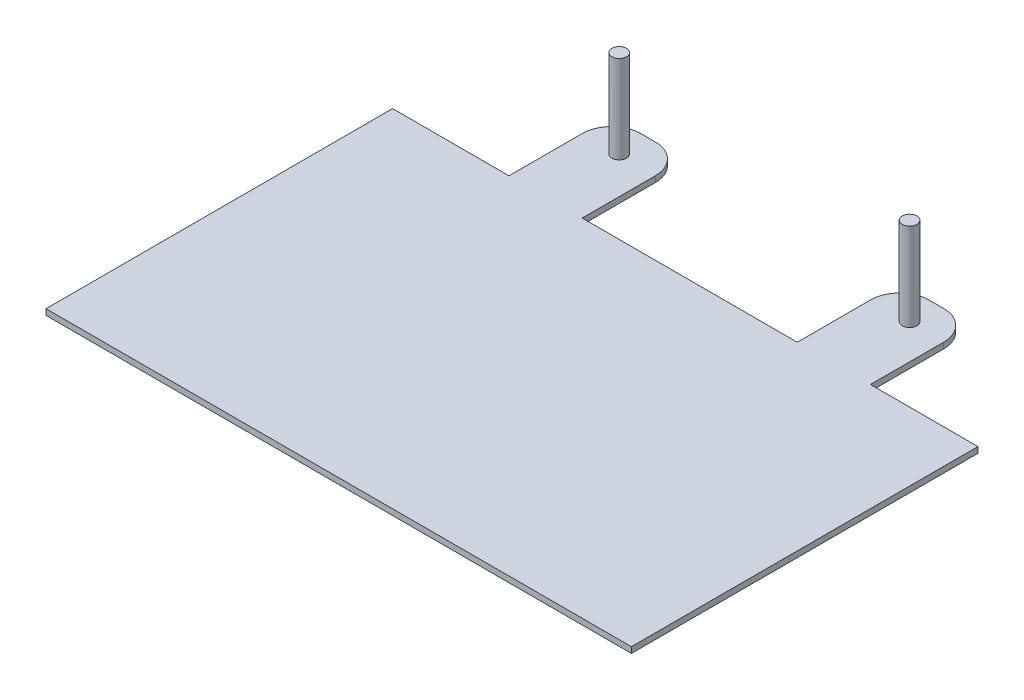
ISO-10303-21;
HEADER;
FILE_DESCRIPTION(('STEP AP214'),'2;1');
FILE_NAME('part.step','',(''),(''),'','','');
FILE_SCHEMA(('AUTOMOTIVE_DESIGN { 1 0 10303 214 1 1 1 1 }'));
ENDSEC;
DATA;
#1=APPLICATION_CONTEXT('core data for automotive mechanical design processes');
#2=APPLICATION_PROTOCOL_DEFINITION('international standard','automotive_design',2000,#1);
#3=PRODUCT_CONTEXT('',#1,'mechanical');
#4=PRODUCT('Part','Part','',(#3));
#5=PRODUCT_RELATED_PRODUCT_CATEGORY('part','',(#4));
#6=PRODUCT_DEFINITION_FORMATION('','',#4);
#7=PRODUCT_DEFINITION_CONTEXT('part definition',#1,'design');
#8=PRODUCT_DEFINITION('design','',#6,#7);
#9=PRODUCT_DEFINITION_SHAPE('','',#8);
#10=(LENGTH_UNIT() NAMED_UNIT(*) SI_UNIT(.MILLI.,.METRE.));
#11=(NAMED_UNIT(*) PLANE_ANGLE_UNIT() SI_UNIT($,.RADIAN.));
#12=(NAMED_UNIT(*) SI_UNIT($,.STERADIAN.) SOLID_ANGLE_UNIT());
#13=UNCERTAINTY_MEASURE_WITH_UNIT(LENGTH_MEASURE(1.E-05),#10,'distance_accuracy_value','');
#14=(GEOMETRIC_REPRESENTATION_CONTEXT(3) GLOBAL_UNCERTAINTY_ASSIGNED_CONTEXT((#13)) GLOBAL_UNIT_ASSIGNED_CONTEXT((#10,
#11,#12)) REPRESENTATION_CONTEXT('',''));
#15=CARTESIAN_POINT('',(0.,0.,0.));
#16=DIRECTION('',(0.,0.,1.));
#17=DIRECTION('',(1.,0.,0.));
#18=AXIS2_PLACEMENT_3D('',#15,#16,#17);
#19=CARTESIAN_POINT('',(0.,2.,0.));
#20=DIRECTION('',(1.,0.,0.));
#21=DIRECTION('',(0.,0.,-1.));
#22=AXIS2_PLACEMENT_3D('',#19,#20,#21);
#23=PLANE('',#22);
#24=DIRECTION('',(0.,0.,1.));
#25=VECTOR('',#24,1.);
#26=CARTESIAN_POINT('',(0.,0.,0.));
#27=LINE('',#26,#25);
#28=CARTESIAN_POINT('',(0.,0.,-118.409090909091));
#29=VERTEX_POINT('',#28);
#30=CARTESIAN_POINT('',(0.,0.,0.));
#31=VERTEX_POINT('',#30);
#32=EDGE_CURVE('E180',#29,#31,#27,.T.);
#33=ORIENTED_EDGE('',*,*,#32,.T.);
#34=DIRECTION('',(0.,-1.,0.));
#35=VECTOR('',#34,1.);
#36=CARTESIAN_POINT('',(0.,2.,0.));
#37=LINE('',#36,#35);
#38=CARTESIAN_POINT('',(0.,2.,0.));
#39=VERTEX_POINT('',#38);
#40=EDGE_CURVE('E248',#39,#31,#37,.T.);
#41=ORIENTED_EDGE('',*,*,#40,.F.);
#42=DIRECTION('',(0.,0.,1.));
#43=VECTOR('',#42,1.);
#44=CARTESIAN_POINT('',(0.,2.,0.));
#45=LINE('',#44,#43);
#46=CARTESIAN_POINT('',(0.,2.,-118.409090909091));
#47=VERTEX_POINT('',#46);
#48=EDGE_CURVE('E211',#47,#39,#45,.T.);
#49=ORIENTED_EDGE('',*,*,#48,.F.);
#50=DIRECTION('',(0.,-1.,0.));
#51=VECTOR('',#50,1.);
#52=CARTESIAN_POINT('',(0.,2.,-118.409090909091));
#53=LINE('',#52,#51);
#54=EDGE_CURVE('E176',#47,#29,#53,.T.);
#55=ORIENTED_EDGE('',*,*,#54,.T.);
#56=EDGE_LOOP('',(#33,#41,#49,#55));
#57=FACE_BOUND('',#56,.T.);
#58=ADVANCED_FACE('F35',(#57),#23,.F.);
#59=CARTESIAN_POINT('',(0.,2.,0.));
#60=DIRECTION('',(0.,0.,-1.));
#61=DIRECTION('',(-1.,0.,0.));
#62=AXIS2_PLACEMENT_3D('',#59,#60,#61);
#63=PLANE('',#62);
#64=DIRECTION('',(1.,0.,0.));
#65=VECTOR('',#64,1.);
#66=CARTESIAN_POINT('',(0.,0.,0.));
#67=LINE('',#66,#65);
#68=CARTESIAN_POINT('',(200.,0.,0.));
#69=VERTEX_POINT('',#68);
#70=EDGE_CURVE('E183',#31,#69,#67,.T.);
#71=ORIENTED_EDGE('',*,*,#70,.T.);
#72=DIRECTION('',(0.,-1.,0.));
#73=VECTOR('',#72,1.);
#74=CARTESIAN_POINT('',(200.,2.,0.));
#75=LINE('',#74,#73);
#76=CARTESIAN_POINT('',(200.,2.,0.));
#77=VERTEX_POINT('',#76);
#78=EDGE_CURVE('E245',#77,#69,#75,.T.);
#79=ORIENTED_EDGE('',*,*,#78,.F.);
#80=DIRECTION('',(1.,0.,0.));
#81=VECTOR('',#80,1.);
#82=CARTESIAN_POINT('',(0.,2.,0.));
#83=LINE('',#82,#81);
#84=EDGE_CURVE('E119',#39,#77,#83,.T.);
#85=ORIENTED_EDGE('',*,*,#84,.F.);
#86=ORIENTED_EDGE('',*,*,#40,.T.);
#87=EDGE_LOOP('',(#71,#79,#85,#86));
#88=FACE_BOUND('',#87,.T.);
#89=ADVANCED_FACE('F271',(#88),#63,.F.);
#90=CARTESIAN_POINT('',(200.,2.,0.));
#91=DIRECTION('',(-1.,0.,0.));
#92=DIRECTION('',(0.,0.,1.));
#93=AXIS2_PLACEMENT_3D('',#90,#91,#92);
#94=PLANE('',#93);
#95=DIRECTION('',(0.,0.,-1.));
#96=VECTOR('',#95,1.);
#97=CARTESIAN_POINT('',(200.,0.,0.));
#98=LINE('',#97,#96);
#99=CARTESIAN_POINT('',(200.,0.,-118.409090909091));
#100=VERTEX_POINT('',#99);
#101=EDGE_CURVE('E186',#69,#100,#98,.T.);
#102=ORIENTED_EDGE('',*,*,#101,.T.);
#103=DIRECTION('',(0.,-1.,0.));
#104=VECTOR('',#103,1.);
#105=CARTESIAN_POINT('',(200.,2.,-118.409090909091));
#106=LINE('',#105,#104);
#107=CARTESIAN_POINT('',(200.,2.,-118.409090909091));
#108=VERTEX_POINT('',#107);
#109=EDGE_CURVE('E242',#108,#100,#106,.T.);
#110=ORIENTED_EDGE('',*,*,#109,.F.);
#111=DIRECTION('',(0.,0.,-1.));
#112=VECTOR('',#111,1.);
#113=CARTESIAN_POINT('',(200.,2.,0.));
#114=LINE('',#113,#112);
#115=EDGE_CURVE('E285',#77,#108,#114,.T.);
#116=ORIENTED_EDGE('',*,*,#115,.F.);
#117=ORIENTED_EDGE('',*,*,#78,.T.);
#118=EDGE_LOOP('',(#102,#110,#116,#117));
#119=FACE_BOUND('',#118,.T.);
#120=ADVANCED_FACE('F276',(#119),#94,.F.);
#121=CARTESIAN_POINT('',(163.257575757576,2.,-118.409090909091));
#122=DIRECTION('',(0.,0.,1.));
#123=DIRECTION('',(1.,0.,0.));
#124=AXIS2_PLACEMENT_3D('',#121,#122,#123);
#125=PLANE('',#124);
#126=DIRECTION('',(-1.,0.,0.));
#127=VECTOR('',#126,1.);
#128=CARTESIAN_POINT('',(163.257575757576,0.,-118.409090909091));
#129=LINE('',#128,#127);
#130=CARTESIAN_POINT('',(163.257575757576,0.,-118.409090909091));
#131=VERTEX_POINT('',#130);
#132=EDGE_CURVE('E188',#100,#131,#129,.T.);
#133=ORIENTED_EDGE('',*,*,#132,.T.);
#134=DIRECTION('',(0.,-1.,0.));
#135=VECTOR('',#134,1.);
#136=CARTESIAN_POINT('',(163.257575757576,2.,-118.409090909091));
#137=LINE('',#136,#135);
#138=CARTESIAN_POINT('',(163.257575757576,2.,-118.409090909091));
#139=VERTEX_POINT('',#138);
#140=EDGE_CURVE('E239',#139,#131,#137,.T.);
#141=ORIENTED_EDGE('',*,*,#140,.F.);
#142=DIRECTION('',(-1.,0.,0.));
#143=VECTOR('',#142,1.);
#144=CARTESIAN_POINT('',(163.257575757576,2.,-118.409090909091));
#145=LINE('',#144,#143);
#146=EDGE_CURVE('E287',#108,#139,#145,.T.);
#147=ORIENTED_EDGE('',*,*,#146,.F.);
#148=ORIENTED_EDGE('',*,*,#109,.T.);
#149=EDGE_LOOP('',(#133,#141,#147,#148));
#150=FACE_BOUND('',#149,.T.);
#151=ADVANCED_FACE('F353',(#150),#125,.F.);
#152=CARTESIAN_POINT('',(163.257575757576,2.,-118.409090909091));
#153=DIRECTION('',(-1.,0.,0.));
#154=DIRECTION('',(0.,0.,1.));
#155=AXIS2_PLACEMENT_3D('',#152,#153,#154);
#156=PLANE('',#155);
#157=DIRECTION('',(0.,0.,-1.));
#158=VECTOR('',#157,1.);
#159=CARTESIAN_POINT('',(163.257575757576,0.,-118.409090909091));
#160=LINE('',#159,#158);
#161=CARTESIAN_POINT('',(163.257575757576,0.,-143.409090909091));
#162=VERTEX_POINT('',#161);
#163=EDGE_CURVE('E190',#131,#162,#160,.T.);
#164=ORIENTED_EDGE('',*,*,#163,.T.);
#165=DIRECTION('',(0.,-1.,0.));
#166=VECTOR('',#165,1.);
#167=CARTESIAN_POINT('',(163.257575757576,2.,-143.409090909091));
#168=LINE('',#167,#166);
#169=CARTESIAN_POINT('',(163.257575757576,2.,-143.409090909091));
#170=VERTEX_POINT('',#169);
#171=EDGE_CURVE('E236',#170,#162,#168,.T.);
#172=ORIENTED_EDGE('',*,*,#171,.F.);
#173=DIRECTION('',(0.,0.,-1.));
#174=VECTOR('',#173,1.);
#175=CARTESIAN_POINT('',(163.257575757576,2.,-118.409090909091));
#176=LINE('',#175,#174);
#177=EDGE_CURVE('E289',#139,#170,#176,.T.);
#178=ORIENTED_EDGE('',*,*,#177,.F.);
#179=ORIENTED_EDGE('',*,*,#140,.T.);
#180=EDGE_LOOP('',(#164,#172,#178,#179));
#181=FACE_BOUND('',#180,.T.);
#182=ADVANCED_FACE('F349',(#181),#156,.F.);
#183=CARTESIAN_POINT('',(153.257575757576,2.,-143.409090909091));
#184=DIRECTION('',(0.,-1.,0.));
#185=DIRECTION('',(0.,0.,-1.));
#186=AXIS2_PLACEMENT_3D('',#183,#184,#185);
#187=CYLINDRICAL_SURFACE('',#186,10.);
#188=CARTESIAN_POINT('',(153.257575757576,0.,-143.409090909091));
#189=DIRECTION('',(0.,1.,0.));
#190=DIRECTION('',(0.,0.,-1.));
#191=AXIS2_PLACEMENT_3D('',#188,#189,#190);
#192=CIRCLE('',#191,10.);
#193=CARTESIAN_POINT('',(153.257575757576,0.,-153.409090909091));
#194=VERTEX_POINT('',#193);
#195=EDGE_CURVE('E192',#162,#194,#192,.T.);
#196=ORIENTED_EDGE('',*,*,#195,.T.);
#197=DIRECTION('',(0.,-1.,0.));
#198=VECTOR('',#197,1.);
#199=CARTESIAN_POINT('',(153.257575757576,2.,-153.409090909091));
#200=LINE('',#199,#198);
#201=CARTESIAN_POINT('',(153.257575757576,2.,-153.409090909091));
#202=VERTEX_POINT('',#201);
#203=EDGE_CURVE('E233',#202,#194,#200,.T.);
#204=ORIENTED_EDGE('',*,*,#203,.F.);
#205=CARTESIAN_POINT('',(153.257575757576,2.,-143.409090909091));
#206=DIRECTION('',(0.,1.,0.));
#207=DIRECTION('',(0.,0.,-1.));
#208=AXIS2_PLACEMENT_3D('',#205,#206,#207);
#209=CIRCLE('',#208,10.);
#210=EDGE_CURVE('E295',#170,#202,#209,.T.);
#211=ORIENTED_EDGE('',*,*,#210,.F.);
#212=ORIENTED_EDGE('',*,*,#171,.T.);
#213=EDGE_LOOP('',(#196,#204,#211,#212));
#214=FACE_BOUND('',#213,.T.);
#215=ADVANCED_FACE('F345',(#214),#187,.T.);
#216=CARTESIAN_POINT('',(148.257575757576,2.,-153.409090909091));
#217=DIRECTION('',(0.,0.,1.));
#218=DIRECTION('',(1.,0.,0.));
#219=AXIS2_PLACEMENT_3D('',#216,#217,#218);
#220=PLANE('',#219);
#221=DIRECTION('',(-1.,0.,0.));
#222=VECTOR('',#221,1.);
#223=CARTESIAN_POINT('',(148.257575757576,0.,-153.409090909091));
#224=LINE('',#223,#222);
#225=CARTESIAN_POINT('',(148.257575757576,0.,-153.409090909091));
#226=VERTEX_POINT('',#225);
#227=EDGE_CURVE('E194',#194,#226,#224,.T.);
#228=ORIENTED_EDGE('',*,*,#227,.T.);
#229=DIRECTION('',(0.,-1.,0.));
#230=VECTOR('',#229,1.);
#231=CARTESIAN_POINT('',(148.257575757576,2.,-153.409090909091));
#232=LINE('',#231,#230);
#233=CARTESIAN_POINT('',(148.257575757576,2.,-153.409090909091));
#234=VERTEX_POINT('',#233);
#235=EDGE_CURVE('E230',#234,#226,#232,.T.);
#236=ORIENTED_EDGE('',*,*,#235,.F.);
#237=DIRECTION('',(-1.,0.,0.));
#238=VECTOR('',#237,1.);
#239=CARTESIAN_POINT('',(148.257575757576,2.,-153.409090909091));
#240=LINE('',#239,#238);
#241=EDGE_CURVE('E297',#202,#234,#240,.T.);
#242=ORIENTED_EDGE('',*,*,#241,.F.);
#243=ORIENTED_EDGE('',*,*,#203,.T.);
#244=EDGE_LOOP('',(#228,#236,#242,#243));
#245=FACE_BOUND('',#244,.T.);
#246=ADVANCED_FACE('F341',(#245),#220,.F.);
#247=CARTESIAN_POINT('',(148.257575757576,2.,-143.409090909091));
#248=DIRECTION('',(0.,-1.,0.));
#249=DIRECTION('',(0.,0.,-1.));
#250=AXIS2_PLACEMENT_3D('',#247,#248,#249);
#251=CYLINDRICAL_SURFACE('',#250,10.);
#252=CARTESIAN_POINT('',(148.257575757576,0.,-143.409090909091));
#253=DIRECTION('',(0.,1.,0.));
#254=DIRECTION('',(0.,0.,-1.));
#255=AXIS2_PLACEMENT_3D('',#252,#253,#254);
#256=CIRCLE('',#255,10.);
#257=CARTESIAN_POINT('',(138.257575757576,0.,-143.409090909091));
#258=VERTEX_POINT('',#257);
#259=EDGE_CURVE('E196',#226,#258,#256,.T.);
#260=ORIENTED_EDGE('',*,*,#259,.T.);
#261=DIRECTION('',(0.,-1.,0.));
#262=VECTOR('',#261,1.);
#263=CARTESIAN_POINT('',(138.257575757576,2.,-143.409090909091));
#264=LINE('',#263,#262);
#265=CARTESIAN_POINT('',(138.257575757576,2.,-143.409090909091));
#266=VERTEX_POINT('',#265);
#267=EDGE_CURVE('E227',#266,#258,#264,.T.);
#268=ORIENTED_EDGE('',*,*,#267,.F.);
#269=CARTESIAN_POINT('',(148.257575757576,2.,-143.409090909091));
#270=DIRECTION('',(0.,1.,0.));
#271=DIRECTION('',(0.,0.,-1.));
#272=AXIS2_PLACEMENT_3D('',#269,#270,#271);
#273=CIRCLE('',#272,10.);
#274=EDGE_CURVE('E299',#234,#266,#273,.T.);
#275=ORIENTED_EDGE('',*,*,#274,.F.);
#276=ORIENTED_EDGE('',*,*,#235,.T.);
#277=EDGE_LOOP('',(#260,#268,#275,#276));
#278=FACE_BOUND('',#277,.T.);
#279=ADVANCED_FACE('F336',(#278),#251,.T.);
#280=CARTESIAN_POINT('',(138.257575757576,2.,-118.409090909091));
#281=DIRECTION('',(1.,0.,0.));
#282=DIRECTION('',(0.,0.,-1.));
#283=AXIS2_PLACEMENT_3D('',#280,#281,#282);
#284=PLANE('',#283);
#285=DIRECTION('',(0.,0.,1.));
#286=VECTOR('',#285,1.);
#287=CARTESIAN_POINT('',(138.257575757576,0.,-118.409090909091));
#288=LINE('',#287,#286);
#289=CARTESIAN_POINT('',(138.257575757576,0.,-118.409090909091));
#290=VERTEX_POINT('',#289);
#291=EDGE_CURVE('E198',#258,#290,#288,.T.);
#292=ORIENTED_EDGE('',*,*,#291,.T.);
#293=DIRECTION('',(0.,-1.,0.));
#294=VECTOR('',#293,1.);
#295=CARTESIAN_POINT('',(138.257575757576,2.,-118.409090909091));
#296=LINE('',#295,#294);
#297=CARTESIAN_POINT('',(138.257575757576,2.,-118.409090909091));
#298=VERTEX_POINT('',#297);
#299=EDGE_CURVE('E224',#298,#290,#296,.T.);
#300=ORIENTED_EDGE('',*,*,#299,.F.);
#301=DIRECTION('',(0.,0.,1.));
#302=VECTOR('',#301,1.);
#303=CARTESIAN_POINT('',(138.257575757576,2.,-118.409090909091));
#304=LINE('',#303,#302);
#305=EDGE_CURVE('E301',#266,#298,#304,.T.);
#306=ORIENTED_EDGE('',*,*,#305,.F.);
#307=ORIENTED_EDGE('',*,*,#267,.T.);
#308=EDGE_LOOP('',(#292,#300,#306,#307));
#309=FACE_BOUND('',#308,.T.);
#310=ADVANCED_FACE('F330',(#309),#284,.F.);
#311=CARTESIAN_POINT('',(64.7727272727273,2.,-118.409090909091));
#312=DIRECTION('',(0.,0.,1.));
#313=DIRECTION('',(1.,0.,0.));
#314=AXIS2_PLACEMENT_3D('',#311,#312,#313);
#315=PLANE('',#314);
#316=DIRECTION('',(-1.,0.,0.));
#317=VECTOR('',#316,1.);
#318=CARTESIAN_POINT('',(64.7727272727273,0.,-118.409090909091));
#319=LINE('',#318,#317);
#320=CARTESIAN_POINT('',(64.7727272727273,0.,-118.409090909091));
#321=VERTEX_POINT('',#320);
#322=EDGE_CURVE('E200',#290,#321,#319,.T.);
#323=ORIENTED_EDGE('',*,*,#322,.T.);
#324=DIRECTION('',(0.,-1.,0.));
#325=VECTOR('',#324,1.);
#326=CARTESIAN_POINT('',(64.7727272727273,2.,-118.409090909091));
#327=LINE('',#326,#325);
#328=CARTESIAN_POINT('',(64.7727272727273,2.,-118.409090909091));
#329=VERTEX_POINT('',#328);
#330=EDGE_CURVE('E221',#329,#321,#327,.T.);
#331=ORIENTED_EDGE('',*,*,#330,.F.);
#332=DIRECTION('',(-1.,0.,0.));
#333=VECTOR('',#332,1.);
#334=CARTESIAN_POINT('',(64.7727272727273,2.,-118.409090909091));
#335=LINE('',#334,#333);
#336=EDGE_CURVE('E303',#298,#329,#335,.T.);
#337=ORIENTED_EDGE('',*,*,#336,.F.);
#338=ORIENTED_EDGE('',*,*,#299,.T.);
#339=EDGE_LOOP('',(#323,#331,#337,#338));
#340=FACE_BOUND('',#339,.T.);
#341=ADVANCED_FACE('F326',(#340),#315,.F.);
#342=CARTESIAN_POINT('',(64.7727272727273,2.,-118.409090909091));
#343=DIRECTION('',(-1.,0.,0.));
#344=DIRECTION('',(0.,0.,1.));
#345=AXIS2_PLACEMENT_3D('',#342,#343,#344);
#346=PLANE('',#345);
#347=DIRECTION('',(0.,0.,-1.));
#348=VECTOR('',#347,1.);
#349=CARTESIAN_POINT('',(64.7727272727273,0.,-118.409090909091));
#350=LINE('',#349,#348);
#351=CARTESIAN_POINT('',(64.7727272727273,0.,-143.409090909091));
#352=VERTEX_POINT('',#351);
#353=EDGE_CURVE('E202',#321,#352,#350,.T.);
#354=ORIENTED_EDGE('',*,*,#353,.T.);
#355=DIRECTION('',(0.,-1.,0.));
#356=VECTOR('',#355,1.);
#357=CARTESIAN_POINT('',(64.7727272727273,2.,-143.409090909091));
#358=LINE('',#357,#356);
#359=CARTESIAN_POINT('',(64.7727272727273,2.,-143.409090909091));
#360=VERTEX_POINT('',#359);
#361=EDGE_CURVE('E218',#360,#352,#358,.T.);
#362=ORIENTED_EDGE('',*,*,#361,.F.);
#363=DIRECTION('',(0.,0.,-1.));
#364=VECTOR('',#363,1.);
#365=CARTESIAN_POINT('',(64.7727272727273,2.,-118.409090909091));
#366=LINE('',#365,#364);
#367=EDGE_CURVE('E305',#329,#360,#366,.T.);
#368=ORIENTED_EDGE('',*,*,#367,.F.);
#369=ORIENTED_EDGE('',*,*,#330,.T.);
#370=EDGE_LOOP('',(#354,#362,#368,#369));
#371=FACE_BOUND('',#370,.T.);
#372=ADVANCED_FACE('F322',(#371),#346,.F.);
#373=CARTESIAN_POINT('',(54.7727272727273,2.,-143.409090909091));
#374=DIRECTION('',(0.,-1.,0.));
#375=DIRECTION('',(0.,0.,-1.));
#376=AXIS2_PLACEMENT_3D('',#373,#374,#375);
#377=CYLINDRICAL_SURFACE('',#376,10.);
#378=CARTESIAN_POINT('',(54.7727272727273,0.,-143.409090909091));
#379=DIRECTION('',(0.,1.,0.));
#380=DIRECTION('',(0.,0.,-1.));
#381=AXIS2_PLACEMENT_3D('',#378,#379,#380);
#382=CIRCLE('',#381,10.);
#383=CARTESIAN_POINT('',(54.7727272727272,0.,-153.409090909091));
#384=VERTEX_POINT('',#383);
#385=EDGE_CURVE('E204',#352,#384,#382,.T.);
#386=ORIENTED_EDGE('',*,*,#385,.T.);
#387=DIRECTION('',(0.,-1.,0.));
#388=VECTOR('',#387,1.);
#389=CARTESIAN_POINT('',(54.7727272727272,2.,-153.409090909091));
#390=LINE('',#389,#388);
#391=CARTESIAN_POINT('',(54.7727272727272,2.,-153.409090909091));
#392=VERTEX_POINT('',#391);
#393=EDGE_CURVE('E215',#392,#384,#390,.T.);
#394=ORIENTED_EDGE('',*,*,#393,.F.);
#395=CARTESIAN_POINT('',(54.7727272727273,2.,-143.409090909091));
#396=DIRECTION('',(0.,1.,0.));
#397=DIRECTION('',(0.,0.,-1.));
#398=AXIS2_PLACEMENT_3D('',#395,#396,#397);
#399=CIRCLE('',#398,10.);
#400=EDGE_CURVE('E307',#360,#392,#399,.T.);
#401=ORIENTED_EDGE('',*,*,#400,.F.);
#402=ORIENTED_EDGE('',*,*,#361,.T.);
#403=EDGE_LOOP('',(#386,#394,#401,#402));
#404=FACE_BOUND('',#403,.T.);
#405=ADVANCED_FACE('F313',(#404),#377,.T.);
#406=CARTESIAN_POINT('',(49.7727272727273,2.,-153.409090909091));
#407=DIRECTION('',(0.,0.,1.));
#408=DIRECTION('',(1.,0.,0.));
#409=AXIS2_PLACEMENT_3D('',#406,#407,#408);
#410=PLANE('',#409);
#411=DIRECTION('',(-1.,0.,0.));
#412=VECTOR('',#411,1.);
#413=CARTESIAN_POINT('',(49.7727272727273,0.,-153.409090909091));
#414=LINE('',#413,#412);
#415=CARTESIAN_POINT('',(49.7727272727273,0.,-153.409090909091));
#416=VERTEX_POINT('',#415);
#417=EDGE_CURVE('E206',#384,#416,#414,.T.);
#418=ORIENTED_EDGE('',*,*,#417,.T.);
#419=DIRECTION('',(0.,-1.,0.));
#420=VECTOR('',#419,1.);
#421=CARTESIAN_POINT('',(49.7727272727273,2.,-153.409090909091));
#422=LINE('',#421,#420);
#423=CARTESIAN_POINT('',(49.7727272727273,2.,-153.409090909091));
#424=VERTEX_POINT('',#423);
#425=EDGE_CURVE('E171',#424,#416,#422,.T.);
#426=ORIENTED_EDGE('',*,*,#425,.F.);
#427=DIRECTION('',(-1.,0.,0.));
#428=VECTOR('',#427,1.);
#429=CARTESIAN_POINT('',(49.7727272727273,2.,-153.409090909091));
#430=LINE('',#429,#428);
#431=EDGE_CURVE('E162',#392,#424,#430,.T.);
#432=ORIENTED_EDGE('',*,*,#431,.F.);
#433=ORIENTED_EDGE('',*,*,#393,.T.);
#434=EDGE_LOOP('',(#418,#426,#432,#433));
#435=FACE_BOUND('',#434,.T.);
#436=ADVANCED_FACE('F317',(#435),#410,.F.);
#437=CARTESIAN_POINT('',(49.7727272727273,2.,-143.409090909091));
#438=DIRECTION('',(0.,-1.,0.));
#439=DIRECTION('',(0.,0.,-1.));
#440=AXIS2_PLACEMENT_3D('',#437,#438,#439);
#441=CYLINDRICAL_SURFACE('',#440,10.);
#442=CARTESIAN_POINT('',(49.7727272727273,0.,-143.409090909091));
#443=DIRECTION('',(0.,1.,0.));
#444=DIRECTION('',(0.,0.,-1.));
#445=AXIS2_PLACEMENT_3D('',#442,#443,#444);
#446=CIRCLE('',#445,10.);
#447=CARTESIAN_POINT('',(39.7727272727273,0.,-143.409090909091));
#448=VERTEX_POINT('',#447);
#449=EDGE_CURVE('E170',#416,#448,#446,.T.);
#450=ORIENTED_EDGE('',*,*,#449,.T.);
#451=DIRECTION('',(0.,-1.,0.));
#452=VECTOR('',#451,1.);
#453=CARTESIAN_POINT('',(39.7727272727273,2.,-143.409090909091));
#454=LINE('',#453,#452);
#455=CARTESIAN_POINT('',(39.7727272727273,2.,-143.409090909091));
#456=VERTEX_POINT('',#455);
#457=EDGE_CURVE('E167',#456,#448,#454,.T.);
#458=ORIENTED_EDGE('',*,*,#457,.F.);
#459=CARTESIAN_POINT('',(49.7727272727273,2.,-143.409090909091));
#460=DIRECTION('',(0.,1.,0.));
#461=DIRECTION('',(0.,0.,-1.));
#462=AXIS2_PLACEMENT_3D('',#459,#460,#461);
#463=CIRCLE('',#462,10.);
#464=EDGE_CURVE('E156',#424,#456,#463,.T.);
#465=ORIENTED_EDGE('',*,*,#464,.F.);
#466=ORIENTED_EDGE('',*,*,#425,.T.);
#467=EDGE_LOOP('',(#450,#458,#465,#466));
#468=FACE_BOUND('',#467,.T.);
#469=ADVANCED_FACE('F168',(#468),#441,.T.);
#470=CARTESIAN_POINT('',(39.7727272727273,2.,-118.409090909091));
#471=DIRECTION('',(1.,0.,0.));
#472=DIRECTION('',(0.,0.,-1.));
#473=AXIS2_PLACEMENT_3D('',#470,#471,#472);
#474=PLANE('',#473);
#475=DIRECTION('',(0.,0.,1.));
#476=VECTOR('',#475,1.);
#477=CARTESIAN_POINT('',(39.7727272727273,0.,-118.409090909091));
#478=LINE('',#477,#476);
#479=CARTESIAN_POINT('',(39.7727272727273,0.,-118.409090909091));
#480=VERTEX_POINT('',#479);
#481=EDGE_CURVE('E104',#448,#480,#478,.T.);
#482=ORIENTED_EDGE('',*,*,#481,.T.);
#483=DIRECTION('',(0.,-1.,0.));
#484=VECTOR('',#483,1.);
#485=CARTESIAN_POINT('',(39.7727272727273,2.,-118.409090909091));
#486=LINE('',#485,#484);
#487=CARTESIAN_POINT('',(39.7727272727273,2.,-118.409090909091));
#488=VERTEX_POINT('',#487);
#489=EDGE_CURVE('E172',#488,#480,#486,.T.);
#490=ORIENTED_EDGE('',*,*,#489,.F.);
#491=DIRECTION('',(0.,0.,1.));
#492=VECTOR('',#491,1.);
#493=CARTESIAN_POINT('',(39.7727272727273,2.,-118.409090909091));
#494=LINE('',#493,#492);
#495=EDGE_CURVE('E160',#456,#488,#494,.T.);
#496=ORIENTED_EDGE('',*,*,#495,.F.);
#497=ORIENTED_EDGE('',*,*,#457,.T.);
#498=EDGE_LOOP('',(#482,#490,#496,#497));
#499=FACE_BOUND('',#498,.T.);
#500=ADVANCED_FACE('F174',(#499),#474,.F.);
#501=CARTESIAN_POINT('',(0.,2.,-118.409090909091));
#502=DIRECTION('',(0.,0.,1.));
#503=DIRECTION('',(1.,0.,0.));
#504=AXIS2_PLACEMENT_3D('',#501,#502,#503);
#505=PLANE('',#504);
#506=DIRECTION('',(-1.,0.,0.));
#507=VECTOR('',#506,1.);
#508=CARTESIAN_POINT('',(0.,0.,-118.409090909091));
#509=LINE('',#508,#507);
#510=EDGE_CURVE('E110',#480,#29,#509,.T.);
#511=ORIENTED_EDGE('',*,*,#510,.T.);
#512=ORIENTED_EDGE('',*,*,#54,.F.);
#513=DIRECTION('',(-1.,0.,0.));
#514=VECTOR('',#513,1.);
#515=CARTESIAN_POINT('',(0.,2.,-118.409090909091));
#516=LINE('',#515,#514);
#517=EDGE_CURVE('E51',#488,#47,#516,.T.);
#518=ORIENTED_EDGE('',*,*,#517,.F.);
#519=ORIENTED_EDGE('',*,*,#489,.T.);
#520=EDGE_LOOP('',(#511,#512,#518,#519));
#521=FACE_BOUND('',#520,.T.);
#522=ADVANCED_FACE('F256',(#521),#505,.F.);
#523=CARTESIAN_POINT('',(49.7727272727273,2.,-143.409090909091));
#524=DIRECTION('',(0.,-1.,0.));
#525=DIRECTION('',(0.,0.,-1.));
#526=AXIS2_PLACEMENT_3D('',#523,#524,#525);
#527=PLANE('',#526);
#528=CARTESIAN_POINT('',(151.328174323837,2.,-143.695636012848));
#529=DIRECTION('',(0.,-1.,0.));
#530=DIRECTION('',(0.,0.,-1.));
#531=AXIS2_PLACEMENT_3D('',#528,#529,#530);
#532=CIRCLE('',#531,2.5);
#533=CARTESIAN_POINT('',(151.328174323837,2.,-146.195636012848));
#534=VERTEX_POINT('',#533);
#535=EDGE_CURVE('E11',#534,#534,#532,.F.);
#536=ORIENTED_EDGE('',*,*,#535,.F.);
#537=EDGE_LOOP('',(#536));
#538=FACE_BOUND('',#537,.T.);
#539=CARTESIAN_POINT('',(52.1192403695551,2.,-143.695636012848));
#540=DIRECTION('',(0.,-1.,0.));
#541=DIRECTION('',(0.,0.,-1.));
#542=AXIS2_PLACEMENT_3D('',#539,#540,#541);
#543=CIRCLE('',#542,2.5);
#544=CARTESIAN_POINT('',(52.1192403695551,2.,-146.195636012848));
#545=VERTEX_POINT('',#544);
#546=EDGE_CURVE('E43',#545,#545,#543,.F.);
#547=ORIENTED_EDGE('',*,*,#546,.F.);
#548=EDGE_LOOP('',(#547));
#549=FACE_BOUND('',#548,.T.);
#550=ORIENTED_EDGE('',*,*,#48,.T.);
#551=ORIENTED_EDGE('',*,*,#84,.T.);
#552=ORIENTED_EDGE('',*,*,#115,.T.);
#553=ORIENTED_EDGE('',*,*,#146,.T.);
#554=ORIENTED_EDGE('',*,*,#177,.T.);
#555=ORIENTED_EDGE('',*,*,#210,.T.);
#556=ORIENTED_EDGE('',*,*,#241,.T.);
#557=ORIENTED_EDGE('',*,*,#274,.T.);
#558=ORIENTED_EDGE('',*,*,#305,.T.);
#559=ORIENTED_EDGE('',*,*,#336,.T.);
#560=ORIENTED_EDGE('',*,*,#367,.T.);
#561=ORIENTED_EDGE('',*,*,#400,.T.);
#562=ORIENTED_EDGE('',*,*,#431,.T.);
#563=ORIENTED_EDGE('',*,*,#464,.T.);
#564=ORIENTED_EDGE('',*,*,#495,.T.);
#565=ORIENTED_EDGE('',*,*,#517,.T.);
#566=EDGE_LOOP('',(#550,#551,#552,#553,#554,#555,#556,#557,#558,#559,#560,#561,#562,#563,#564,#565));
#567=FACE_BOUND('',#566,.T.);
#568=ADVANCED_FACE('F158',(#538,#549,#567),#527,.F.);
#569=CARTESIAN_POINT('',(49.7727272727273,0.,-143.409090909091));
#570=DIRECTION('',(0.,-1.,0.));
#571=DIRECTION('',(0.,0.,-1.));
#572=AXIS2_PLACEMENT_3D('',#569,#570,#571);
#573=PLANE('',#572);
#574=ORIENTED_EDGE('',*,*,#32,.F.);
#575=ORIENTED_EDGE('',*,*,#510,.F.);
#576=ORIENTED_EDGE('',*,*,#481,.F.);
#577=ORIENTED_EDGE('',*,*,#449,.F.);
#578=ORIENTED_EDGE('',*,*,#417,.F.);
#579=ORIENTED_EDGE('',*,*,#385,.F.);
#580=ORIENTED_EDGE('',*,*,#353,.F.);
#581=ORIENTED_EDGE('',*,*,#322,.F.);
#582=ORIENTED_EDGE('',*,*,#291,.F.);
#583=ORIENTED_EDGE('',*,*,#259,.F.);
#584=ORIENTED_EDGE('',*,*,#227,.F.);
#585=ORIENTED_EDGE('',*,*,#195,.F.);
#586=ORIENTED_EDGE('',*,*,#163,.F.);
#587=ORIENTED_EDGE('',*,*,#132,.F.);
#588=ORIENTED_EDGE('',*,*,#101,.F.);
#589=ORIENTED_EDGE('',*,*,#70,.F.);
#590=EDGE_LOOP('',(#574,#575,#576,#577,#578,#579,#580,#581,#582,#583,#584,#585,#586,#587,#588,#589));
#591=FACE_BOUND('',#590,.T.);
#592=ADVANCED_FACE('F255',(#591),#573,.T.);
#593=CARTESIAN_POINT('',(52.1192403695551,32.,-143.695636012848));
#594=DIRECTION('',(0.,-1.,0.));
#595=DIRECTION('',(0.,0.,-1.));
#596=AXIS2_PLACEMENT_3D('',#593,#594,#595);
#597=CYLINDRICAL_SURFACE('',#596,2.5);
#598=CARTESIAN_POINT('',(52.1192403695551,32.,-143.695636012848));
#599=DIRECTION('',(0.,1.,0.));
#600=DIRECTION('',(0.,0.,1.));
#601=AXIS2_PLACEMENT_3D('',#598,#599,#600);
#602=CIRCLE('',#601,2.5);
#603=CARTESIAN_POINT('',(52.1192403695551,32.,-141.195636012848));
#604=VERTEX_POINT('',#603);
#605=EDGE_CURVE('E184',#604,#604,#602,.T.);
#606=ORIENTED_EDGE('',*,*,#605,.F.);
#607=EDGE_LOOP('',(#606));
#608=FACE_BOUND('',#607,.T.);
#609=ORIENTED_EDGE('',*,*,#546,.T.);
#610=EDGE_LOOP('',(#609));
#611=FACE_BOUND('',#610,.T.);
#612=ADVANCED_FACE('F252',(#608,#611),#597,.T.);
#613=CARTESIAN_POINT('',(52.1192403695551,32.,-143.695636012848));
#614=DIRECTION('',(0.,1.,0.));
#615=DIRECTION('',(0.,0.,1.));
#616=AXIS2_PLACEMENT_3D('',#613,#614,#615);
#617=PLANE('',#616);
#618=ORIENTED_EDGE('',*,*,#605,.T.);
#619=EDGE_LOOP('',(#618));
#620=FACE_BOUND('',#619,.T.);
#621=ADVANCED_FACE('F402',(#620),#617,.T.);
#622=CARTESIAN_POINT('',(151.328174323837,32.,-143.695636012848));
#623=DIRECTION('',(0.,-1.,0.));
#624=DIRECTION('',(0.,0.,-1.));
#625=AXIS2_PLACEMENT_3D('',#622,#623,#624);
#626=CYLINDRICAL_SURFACE('',#625,2.5);
#627=CARTESIAN_POINT('',(151.328174323837,32.,-143.695636012848));
#628=DIRECTION('',(0.,1.,0.));
#629=DIRECTION('',(0.,0.,1.));
#630=AXIS2_PLACEMENT_3D('',#627,#628,#629);
#631=CIRCLE('',#630,2.5);
#632=CARTESIAN_POINT('',(151.328174323837,32.,-141.195636012848));
#633=VERTEX_POINT('',#632);
#634=EDGE_CURVE('E440',#633,#633,#631,.T.);
#635=ORIENTED_EDGE('',*,*,#634,.F.);
#636=EDGE_LOOP('',(#635));
#637=FACE_BOUND('',#636,.T.);
#638=ORIENTED_EDGE('',*,*,#535,.T.);
#639=EDGE_LOOP('',(#638));
#640=FACE_BOUND('',#639,.T.);
#641=ADVANCED_FACE('F409',(#637,#640),#626,.T.);
#642=CARTESIAN_POINT('',(151.328174323837,32.,-143.695636012848));
#643=DIRECTION('',(0.,1.,0.));
#644=DIRECTION('',(0.,0.,1.));
#645=AXIS2_PLACEMENT_3D('',#642,#643,#644);
#646=PLANE('',#645);
#647=ORIENTED_EDGE('',*,*,#634,.T.);
#648=EDGE_LOOP('',(#647));
#649=FACE_BOUND('',#648,.T.);
#650=ADVANCED_FACE('F417',(#649),#646,.T.);
#651=CLOSED_SHELL('',(#58,#89,#120,#151,#182,#215,#246,#279,#310,#341,#372,#405,#436,#469,#500,
#522,#568,#592,#612,#621,#641,#650));
#652=MANIFOLD_SOLID_BREP('B2',#651);
#653=ADVANCED_BREP_SHAPE_REPRESENTATION('',(#18,#652),#14);
#654=SHAPE_DEFINITION_REPRESENTATION(#9,#653);
ENDSEC;
END-ISO-10303-21;
